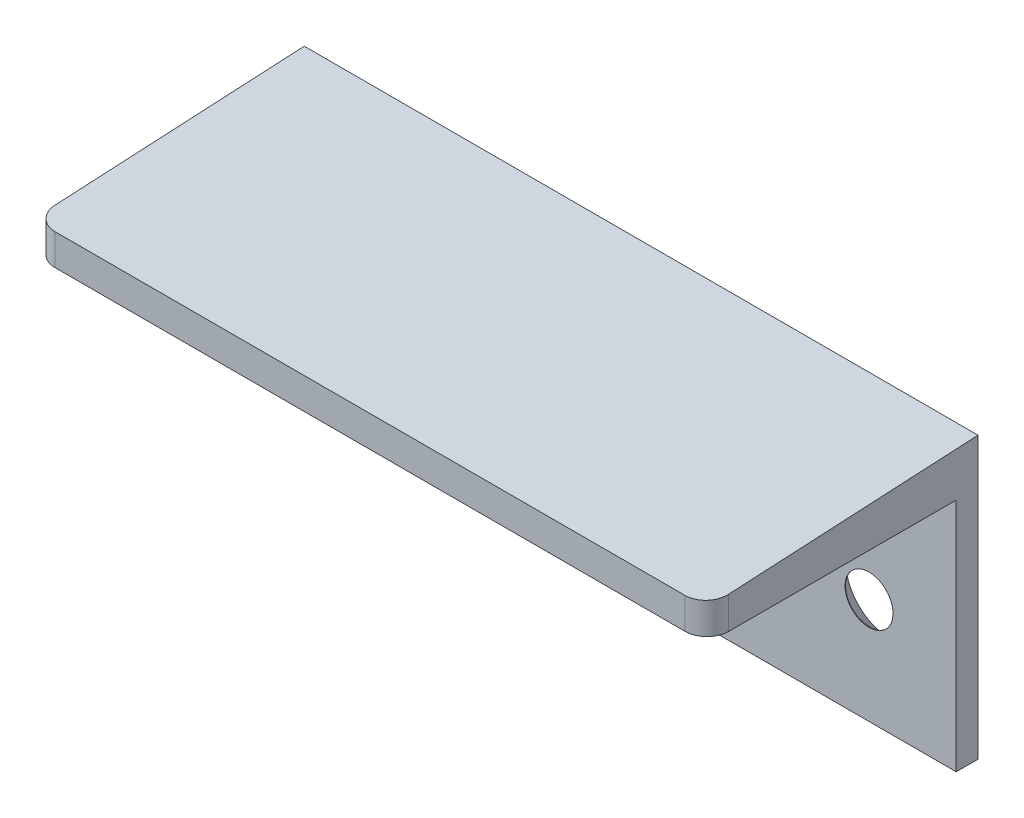
ISO-10303-21;
HEADER;
FILE_DESCRIPTION(('STEP AP214'),'2;1');
FILE_NAME('part.step','',(''),(''),'','','');
FILE_SCHEMA(('AUTOMOTIVE_DESIGN { 1 0 10303 214 1 1 1 1 }'));
ENDSEC;
DATA;
#1=APPLICATION_CONTEXT('core data for automotive mechanical design processes');
#2=APPLICATION_PROTOCOL_DEFINITION('international standard','automotive_design',2000,#1);
#3=PRODUCT_CONTEXT('',#1,'mechanical');
#4=PRODUCT('Part','Part','',(#3));
#5=PRODUCT_RELATED_PRODUCT_CATEGORY('part','',(#4));
#6=PRODUCT_DEFINITION_FORMATION('','',#4);
#7=PRODUCT_DEFINITION_CONTEXT('part definition',#1,'design');
#8=PRODUCT_DEFINITION('design','',#6,#7);
#9=PRODUCT_DEFINITION_SHAPE('','',#8);
#10=(LENGTH_UNIT() NAMED_UNIT(*) SI_UNIT(.MILLI.,.METRE.));
#11=(NAMED_UNIT(*) PLANE_ANGLE_UNIT() SI_UNIT($,.RADIAN.));
#12=(NAMED_UNIT(*) SI_UNIT($,.STERADIAN.) SOLID_ANGLE_UNIT());
#13=UNCERTAINTY_MEASURE_WITH_UNIT(LENGTH_MEASURE(1.E-05),#10,'distance_accuracy_value','');
#14=(GEOMETRIC_REPRESENTATION_CONTEXT(3) GLOBAL_UNCERTAINTY_ASSIGNED_CONTEXT((#13)) GLOBAL_UNIT_ASSIGNED_CONTEXT((#10,
#11,#12)) REPRESENTATION_CONTEXT('',''));
#15=CARTESIAN_POINT('',(0.,0.,0.));
#16=DIRECTION('',(0.,0.,1.));
#17=DIRECTION('',(1.,0.,0.));
#18=AXIS2_PLACEMENT_3D('',#15,#16,#17);
#19=CARTESIAN_POINT('',(38.65,-16.1,2.5));
#20=DIRECTION('',(-1.,0.,0.));
#21=DIRECTION('',(0.,0.,1.));
#22=AXIS2_PLACEMENT_3D('',#19,#20,#21);
#23=PLANE('',#22);
#24=DIRECTION('',(0.,0.0523359562429439,-0.998629534754574));
#25=VECTOR('',#24,1.);
#26=CARTESIAN_POINT('',(38.65,16.1,0.));
#27=LINE('',#26,#25);
#28=CARTESIAN_POINT('',(38.65,14.6011899202843,28.599));
#29=VERTEX_POINT('',#28);
#30=CARTESIAN_POINT('',(38.65,16.1,0.));
#31=VERTEX_POINT('',#30);
#32=EDGE_CURVE('E104',#29,#31,#27,.T.);
#33=ORIENTED_EDGE('',*,*,#32,.F.);
#34=DIRECTION('',(0.,1.,0.));
#35=VECTOR('',#34,1.);
#36=CARTESIAN_POINT('',(38.65,10.9,28.599));
#37=LINE('',#36,#35);
#38=CARTESIAN_POINT('',(38.65,10.9,28.599));
#39=VERTEX_POINT('',#38);
#40=EDGE_CURVE('E48',#29,#39,#37,.F.);
#41=ORIENTED_EDGE('',*,*,#40,.T.);
#42=DIRECTION('',(0.,0.,-1.));
#43=VECTOR('',#42,1.);
#44=CARTESIAN_POINT('',(38.65,10.9,31.099));
#45=LINE('',#44,#43);
#46=CARTESIAN_POINT('',(38.65,10.9,2.5));
#47=VERTEX_POINT('',#46);
#48=EDGE_CURVE('E128',#39,#47,#45,.T.);
#49=ORIENTED_EDGE('',*,*,#48,.T.);
#50=DIRECTION('',(0.,1.,0.));
#51=VECTOR('',#50,1.);
#52=CARTESIAN_POINT('',(38.65,-16.1,2.5));
#53=LINE('',#52,#51);
#54=CARTESIAN_POINT('',(38.65,-16.1,2.5));
#55=VERTEX_POINT('',#54);
#56=EDGE_CURVE('E137',#55,#47,#53,.T.);
#57=ORIENTED_EDGE('',*,*,#56,.F.);
#58=DIRECTION('',(0.,0.,-1.));
#59=VECTOR('',#58,1.);
#60=CARTESIAN_POINT('',(38.65,-16.1,2.5));
#61=LINE('',#60,#59);
#62=CARTESIAN_POINT('',(38.65,-16.1,0.));
#63=VERTEX_POINT('',#62);
#64=EDGE_CURVE('E125',#55,#63,#61,.T.);
#65=ORIENTED_EDGE('',*,*,#64,.T.);
#66=DIRECTION('',(0.,1.,0.));
#67=VECTOR('',#66,1.);
#68=CARTESIAN_POINT('',(38.65,-16.1,0.));
#69=LINE('',#68,#67);
#70=EDGE_CURVE('E119',#63,#31,#69,.T.);
#71=ORIENTED_EDGE('',*,*,#70,.T.);
#72=EDGE_LOOP('',(#33,#41,#49,#57,#65,#71));
#73=FACE_BOUND('',#72,.T.);
#74=ADVANCED_FACE('F39',(#73),#23,.F.);
#75=CARTESIAN_POINT('',(-38.65,-16.1,2.5));
#76=DIRECTION('',(1.,0.,0.));
#77=DIRECTION('',(0.,0.,-1.));
#78=AXIS2_PLACEMENT_3D('',#75,#76,#77);
#79=PLANE('',#78);
#80=DIRECTION('',(0.,-0.0523359562429439,0.998629534754574));
#81=VECTOR('',#80,1.);
#82=CARTESIAN_POINT('',(-38.65,16.1,0.));
#83=LINE('',#82,#81);
#84=CARTESIAN_POINT('',(-38.65,16.1,0.));
#85=VERTEX_POINT('',#84);
#86=CARTESIAN_POINT('',(-38.65,14.6011899202843,28.599));
#87=VERTEX_POINT('',#86);
#88=EDGE_CURVE('E112',#85,#87,#83,.T.);
#89=ORIENTED_EDGE('',*,*,#88,.F.);
#90=DIRECTION('',(0.,-1.,0.));
#91=VECTOR('',#90,1.);
#92=CARTESIAN_POINT('',(-38.65,-16.1,0.));
#93=LINE('',#92,#91);
#94=CARTESIAN_POINT('',(-38.65,-16.1,0.));
#95=VERTEX_POINT('',#94);
#96=EDGE_CURVE('E120',#85,#95,#93,.T.);
#97=ORIENTED_EDGE('',*,*,#96,.T.);
#98=DIRECTION('',(0.,0.,-1.));
#99=VECTOR('',#98,1.);
#100=CARTESIAN_POINT('',(-38.65,-16.1,2.5));
#101=LINE('',#100,#99);
#102=CARTESIAN_POINT('',(-38.65,-16.1,2.5));
#103=VERTEX_POINT('',#102);
#104=EDGE_CURVE('E139',#103,#95,#101,.T.);
#105=ORIENTED_EDGE('',*,*,#104,.F.);
#106=DIRECTION('',(0.,-1.,0.));
#107=VECTOR('',#106,1.);
#108=CARTESIAN_POINT('',(-38.65,-16.1,2.5));
#109=LINE('',#108,#107);
#110=CARTESIAN_POINT('',(-38.65,10.9,2.5));
#111=VERTEX_POINT('',#110);
#112=EDGE_CURVE('E180',#111,#103,#109,.T.);
#113=ORIENTED_EDGE('',*,*,#112,.F.);
#114=DIRECTION('',(0.,0.,-1.));
#115=VECTOR('',#114,1.);
#116=CARTESIAN_POINT('',(-38.65,10.9,31.099));
#117=LINE('',#116,#115);
#118=CARTESIAN_POINT('',(-38.65,10.9,28.599));
#119=VERTEX_POINT('',#118);
#120=EDGE_CURVE('E126',#119,#111,#117,.T.);
#121=ORIENTED_EDGE('',*,*,#120,.F.);
#122=DIRECTION('',(0.,-1.,0.));
#123=VECTOR('',#122,1.);
#124=CARTESIAN_POINT('',(-38.65,16.1,28.599));
#125=LINE('',#124,#123);
#126=EDGE_CURVE('E150',#119,#87,#125,.F.);
#127=ORIENTED_EDGE('',*,*,#126,.T.);
#128=EDGE_LOOP('',(#89,#97,#105,#113,#121,#127));
#129=FACE_BOUND('',#128,.T.);
#130=ADVANCED_FACE('F201',(#129),#79,.F.);
#131=CARTESIAN_POINT('',(0.,0.,31.099));
#132=DIRECTION('',(0.,0.,1.));
#133=DIRECTION('',(1.,0.,0.));
#134=AXIS2_PLACEMENT_3D('',#131,#132,#133);
#135=PLANE('',#134);
#136=DIRECTION('',(0.,1.,0.));
#137=VECTOR('',#136,1.);
#138=CARTESIAN_POINT('',(36.15,16.1,31.099));
#139=LINE('',#138,#137);
#140=CARTESIAN_POINT('',(36.15,10.9,31.099));
#141=VERTEX_POINT('',#140);
#142=CARTESIAN_POINT('',(36.15,14.4701704720767,31.099));
#143=VERTEX_POINT('',#142);
#144=EDGE_CURVE('E142',#141,#143,#139,.T.);
#145=ORIENTED_EDGE('',*,*,#144,.T.);
#146=DIRECTION('',(-1.,0.,0.));
#147=VECTOR('',#146,1.);
#148=CARTESIAN_POINT('',(0.,14.4701704720767,31.099));
#149=LINE('',#148,#147);
#150=CARTESIAN_POINT('',(-36.15,14.4701704720767,31.099));
#151=VERTEX_POINT('',#150);
#152=EDGE_CURVE('E56',#143,#151,#149,.T.);
#153=ORIENTED_EDGE('',*,*,#152,.T.);
#154=DIRECTION('',(0.,-1.,0.));
#155=VECTOR('',#154,1.);
#156=CARTESIAN_POINT('',(-36.15,10.9,31.099));
#157=LINE('',#156,#155);
#158=CARTESIAN_POINT('',(-36.15,10.9,31.099));
#159=VERTEX_POINT('',#158);
#160=EDGE_CURVE('E145',#151,#159,#157,.T.);
#161=ORIENTED_EDGE('',*,*,#160,.T.);
#162=DIRECTION('',(1.,0.,0.));
#163=VECTOR('',#162,1.);
#164=CARTESIAN_POINT('',(-38.65,10.9,31.099));
#165=LINE('',#164,#163);
#166=EDGE_CURVE('E173',#159,#141,#165,.T.);
#167=ORIENTED_EDGE('',*,*,#166,.T.);
#168=EDGE_LOOP('',(#145,#153,#161,#167));
#169=FACE_BOUND('',#168,.T.);
#170=ADVANCED_FACE('F195',(#169),#135,.T.);
#171=CARTESIAN_POINT('',(-36.15,0.,28.599));
#172=DIRECTION('',(0.,1.,0.));
#173=DIRECTION('',(0.,0.,1.));
#174=AXIS2_PLACEMENT_3D('',#171,#172,#173);
#175=CYLINDRICAL_SURFACE('',#174,2.5);
#176=ORIENTED_EDGE('',*,*,#160,.F.);
#177=CARTESIAN_POINT('',(-36.15,14.6011899202843,28.599));
#178=DIRECTION('',(0.,0.998629534754574,0.0523359562429439));
#179=DIRECTION('',(0.,0.052335956242944,-0.998629534754574));
#180=AXIS2_PLACEMENT_3D('',#177,#178,#179);
#181=ELLIPSE('',#180,2.5034308649948,2.5);
#182=EDGE_CURVE('E169',#151,#87,#181,.F.);
#183=ORIENTED_EDGE('',*,*,#182,.T.);
#184=ORIENTED_EDGE('',*,*,#126,.F.);
#185=CARTESIAN_POINT('',(-36.15,10.9,28.599));
#186=DIRECTION('',(0.,1.,0.));
#187=DIRECTION('',(0.,0.,1.));
#188=AXIS2_PLACEMENT_3D('',#185,#186,#187);
#189=CIRCLE('',#188,2.5);
#190=EDGE_CURVE('E63',#159,#119,#189,.F.);
#191=ORIENTED_EDGE('',*,*,#190,.F.);
#192=EDGE_LOOP('',(#176,#183,#184,#191));
#193=FACE_BOUND('',#192,.T.);
#194=ADVANCED_FACE('F199',(#193),#175,.T.);
#195=CARTESIAN_POINT('',(36.15,0.,28.599));
#196=DIRECTION('',(0.,-1.,0.));
#197=DIRECTION('',(0.,0.,-1.));
#198=AXIS2_PLACEMENT_3D('',#195,#196,#197);
#199=CYLINDRICAL_SURFACE('',#198,2.5);
#200=ORIENTED_EDGE('',*,*,#40,.F.);
#201=CARTESIAN_POINT('',(36.15,14.6011899202843,28.599));
#202=DIRECTION('',(0.,0.998629534754574,0.0523359562429439));
#203=DIRECTION('',(0.,-0.052335956242944,0.998629534754574));
#204=AXIS2_PLACEMENT_3D('',#201,#202,#203);
#205=ELLIPSE('',#204,2.5034308649948,2.5);
#206=EDGE_CURVE('E11',#29,#143,#205,.F.);
#207=ORIENTED_EDGE('',*,*,#206,.T.);
#208=ORIENTED_EDGE('',*,*,#144,.F.);
#209=CARTESIAN_POINT('',(36.15,10.9,28.599));
#210=DIRECTION('',(0.,1.,0.));
#211=DIRECTION('',(0.,0.,1.));
#212=AXIS2_PLACEMENT_3D('',#209,#210,#211);
#213=CIRCLE('',#212,2.5);
#214=EDGE_CURVE('E147',#39,#141,#213,.F.);
#215=ORIENTED_EDGE('',*,*,#214,.F.);
#216=EDGE_LOOP('',(#200,#207,#208,#215));
#217=FACE_BOUND('',#216,.T.);
#218=ADVANCED_FACE('F41',(#217),#199,.T.);
#219=CARTESIAN_POINT('',(0.,0.,2.5));
#220=DIRECTION('',(0.,0.,-1.));
#221=DIRECTION('',(-1.,0.,0.));
#222=AXIS2_PLACEMENT_3D('',#219,#220,#221);
#223=PLANE('',#222);
#224=CARTESIAN_POINT('',(28.65,-4.,2.5));
#225=DIRECTION('',(0.,0.,-1.));
#226=DIRECTION('',(-1.,0.,0.));
#227=AXIS2_PLACEMENT_3D('',#224,#225,#226);
#228=CIRCLE('',#227,2.75);
#229=CARTESIAN_POINT('',(25.9,-4.,2.5));
#230=VERTEX_POINT('',#229);
#231=EDGE_CURVE('E43',#230,#230,#228,.T.);
#232=ORIENTED_EDGE('',*,*,#231,.T.);
#233=EDGE_LOOP('',(#232));
#234=FACE_BOUND('',#233,.T.);
#235=CARTESIAN_POINT('',(-28.65,-4.,2.5));
#236=DIRECTION('',(0.,0.,-1.));
#237=DIRECTION('',(-1.,0.,0.));
#238=AXIS2_PLACEMENT_3D('',#235,#236,#237);
#239=CIRCLE('',#238,2.75);
#240=CARTESIAN_POINT('',(-31.4,-4.,2.5));
#241=VERTEX_POINT('',#240);
#242=EDGE_CURVE('E153',#241,#241,#239,.T.);
#243=ORIENTED_EDGE('',*,*,#242,.T.);
#244=EDGE_LOOP('',(#243));
#245=FACE_BOUND('',#244,.T.);
#246=DIRECTION('',(1.,0.,0.));
#247=VECTOR('',#246,1.);
#248=CARTESIAN_POINT('',(-38.65,10.9,2.5));
#249=LINE('',#248,#247);
#250=EDGE_CURVE('E172',#111,#47,#249,.T.);
#251=ORIENTED_EDGE('',*,*,#250,.F.);
#252=ORIENTED_EDGE('',*,*,#112,.T.);
#253=DIRECTION('',(1.,0.,0.));
#254=VECTOR('',#253,1.);
#255=CARTESIAN_POINT('',(-38.65,-16.1,2.5));
#256=LINE('',#255,#254);
#257=EDGE_CURVE('E131',#103,#55,#256,.T.);
#258=ORIENTED_EDGE('',*,*,#257,.T.);
#259=ORIENTED_EDGE('',*,*,#56,.T.);
#260=EDGE_LOOP('',(#251,#252,#258,#259));
#261=FACE_BOUND('',#260,.T.);
#262=ADVANCED_FACE('F186',(#234,#245,#261),#223,.F.);
#263=CARTESIAN_POINT('',(-38.65,-16.1,2.5));
#264=DIRECTION('',(0.,1.,0.));
#265=DIRECTION('',(0.,0.,1.));
#266=AXIS2_PLACEMENT_3D('',#263,#264,#265);
#267=PLANE('',#266);
#268=DIRECTION('',(1.,0.,0.));
#269=VECTOR('',#268,1.);
#270=CARTESIAN_POINT('',(-38.65,-16.1,0.));
#271=LINE('',#270,#269);
#272=EDGE_CURVE('E135',#95,#63,#271,.T.);
#273=ORIENTED_EDGE('',*,*,#272,.T.);
#274=ORIENTED_EDGE('',*,*,#64,.F.);
#275=ORIENTED_EDGE('',*,*,#257,.F.);
#276=ORIENTED_EDGE('',*,*,#104,.T.);
#277=EDGE_LOOP('',(#273,#274,#275,#276));
#278=FACE_BOUND('',#277,.T.);
#279=ADVANCED_FACE('F188',(#278),#267,.F.);
#280=CARTESIAN_POINT('',(0.,0.,0.));
#281=DIRECTION('',(0.,0.,-1.));
#282=DIRECTION('',(-1.,0.,0.));
#283=AXIS2_PLACEMENT_3D('',#280,#281,#282);
#284=PLANE('',#283);
#285=CARTESIAN_POINT('',(28.65,-4.,0.));
#286=DIRECTION('',(0.,0.,-1.));
#287=DIRECTION('',(-1.,0.,0.));
#288=AXIS2_PLACEMENT_3D('',#285,#286,#287);
#289=CIRCLE('',#288,5.2);
#290=CARTESIAN_POINT('',(23.45,-4.,0.));
#291=VERTEX_POINT('',#290);
#292=EDGE_CURVE('E236',#291,#291,#289,.T.);
#293=ORIENTED_EDGE('',*,*,#292,.F.);
#294=EDGE_LOOP('',(#293));
#295=FACE_BOUND('',#294,.T.);
#296=CARTESIAN_POINT('',(-28.65,-4.,0.));
#297=DIRECTION('',(0.,0.,-1.));
#298=DIRECTION('',(-1.,0.,0.));
#299=AXIS2_PLACEMENT_3D('',#296,#297,#298);
#300=CIRCLE('',#299,5.2);
#301=CARTESIAN_POINT('',(-33.85,-4.,0.));
#302=VERTEX_POINT('',#301);
#303=EDGE_CURVE('E160',#302,#302,#300,.T.);
#304=ORIENTED_EDGE('',*,*,#303,.F.);
#305=EDGE_LOOP('',(#304));
#306=FACE_BOUND('',#305,.T.);
#307=ORIENTED_EDGE('',*,*,#70,.F.);
#308=ORIENTED_EDGE('',*,*,#272,.F.);
#309=ORIENTED_EDGE('',*,*,#96,.F.);
#310=DIRECTION('',(-1.,0.,0.));
#311=VECTOR('',#310,1.);
#312=CARTESIAN_POINT('',(-38.65,16.1,0.));
#313=LINE('',#312,#311);
#314=EDGE_CURVE('E107',#31,#85,#313,.T.);
#315=ORIENTED_EDGE('',*,*,#314,.F.);
#316=EDGE_LOOP('',(#307,#308,#309,#315));
#317=FACE_BOUND('',#316,.T.);
#318=ADVANCED_FACE('F117',(#295,#306,#317),#284,.T.);
#319=CARTESIAN_POINT('',(-38.65,10.9,31.099));
#320=DIRECTION('',(0.,1.,0.));
#321=DIRECTION('',(0.,0.,1.));
#322=AXIS2_PLACEMENT_3D('',#319,#320,#321);
#323=PLANE('',#322);
#324=ORIENTED_EDGE('',*,*,#166,.F.);
#325=ORIENTED_EDGE('',*,*,#190,.T.);
#326=ORIENTED_EDGE('',*,*,#120,.T.);
#327=ORIENTED_EDGE('',*,*,#250,.T.);
#328=ORIENTED_EDGE('',*,*,#48,.F.);
#329=ORIENTED_EDGE('',*,*,#214,.T.);
#330=EDGE_LOOP('',(#324,#325,#326,#327,#328,#329));
#331=FACE_BOUND('',#330,.T.);
#332=ADVANCED_FACE('F191',(#331),#323,.F.);
#333=CARTESIAN_POINT('',(0.,16.1,0.));
#334=DIRECTION('',(0.,0.998629534754574,0.0523359562429439));
#335=DIRECTION('',(0.,-0.0523359562429439,0.998629534754574));
#336=AXIS2_PLACEMENT_3D('',#333,#334,#335);
#337=PLANE('',#336);
#338=ORIENTED_EDGE('',*,*,#152,.F.);
#339=ORIENTED_EDGE('',*,*,#206,.F.);
#340=ORIENTED_EDGE('',*,*,#32,.T.);
#341=ORIENTED_EDGE('',*,*,#314,.T.);
#342=ORIENTED_EDGE('',*,*,#88,.T.);
#343=ORIENTED_EDGE('',*,*,#182,.F.);
#344=EDGE_LOOP('',(#338,#339,#340,#341,#342,#343));
#345=FACE_BOUND('',#344,.T.);
#346=ADVANCED_FACE('F106',(#345),#337,.T.);
#347=CARTESIAN_POINT('',(-28.65,-4.,0.));
#348=DIRECTION('',(0.,0.,-1.));
#349=DIRECTION('',(-1.,0.,0.));
#350=AXIS2_PLACEMENT_3D('',#347,#348,#349);
#351=CYLINDRICAL_SURFACE('',#350,2.75);
#352=CARTESIAN_POINT('',(-28.65,-4.,2.45));
#353=DIRECTION('',(0.,0.,-1.));
#354=DIRECTION('',(-1.,0.,0.));
#355=AXIS2_PLACEMENT_3D('',#352,#353,#354);
#356=CIRCLE('',#355,2.75);
#357=CARTESIAN_POINT('',(-31.4,-4.,2.45));
#358=VERTEX_POINT('',#357);
#359=EDGE_CURVE('E155',#358,#358,#356,.T.);
#360=ORIENTED_EDGE('',*,*,#359,.T.);
#361=EDGE_LOOP('',(#360));
#362=FACE_BOUND('',#361,.T.);
#363=ORIENTED_EDGE('',*,*,#242,.F.);
#364=EDGE_LOOP('',(#363));
#365=FACE_BOUND('',#364,.T.);
#366=ADVANCED_FACE('F242',(#362,#365),#351,.F.);
#367=CARTESIAN_POINT('',(-28.65,-4.,0.));
#368=DIRECTION('',(0.,0.,-1.));
#369=DIRECTION('',(-1.,0.,0.));
#370=AXIS2_PLACEMENT_3D('',#367,#368,#369);
#371=CONICAL_SURFACE('',#370,5.2,0.785398163397448);
#372=ORIENTED_EDGE('',*,*,#359,.F.);
#373=EDGE_LOOP('',(#372));
#374=FACE_BOUND('',#373,.T.);
#375=ORIENTED_EDGE('',*,*,#303,.T.);
#376=EDGE_LOOP('',(#375));
#377=FACE_BOUND('',#376,.T.);
#378=ADVANCED_FACE('F239',(#374,#377),#371,.F.);
#379=CARTESIAN_POINT('',(28.65,-4.,0.));
#380=DIRECTION('',(0.,0.,-1.));
#381=DIRECTION('',(-1.,0.,0.));
#382=AXIS2_PLACEMENT_3D('',#379,#380,#381);
#383=CYLINDRICAL_SURFACE('',#382,2.75);
#384=CARTESIAN_POINT('',(28.65,-4.,2.45));
#385=DIRECTION('',(0.,0.,-1.));
#386=DIRECTION('',(-1.,0.,0.));
#387=AXIS2_PLACEMENT_3D('',#384,#385,#386);
#388=CIRCLE('',#387,2.75);
#389=CARTESIAN_POINT('',(25.9,-4.,2.45));
#390=VERTEX_POINT('',#389);
#391=EDGE_CURVE('E292',#390,#390,#388,.T.);
#392=ORIENTED_EDGE('',*,*,#391,.T.);
#393=EDGE_LOOP('',(#392));
#394=FACE_BOUND('',#393,.T.);
#395=ORIENTED_EDGE('',*,*,#231,.F.);
#396=EDGE_LOOP('',(#395));
#397=FACE_BOUND('',#396,.T.);
#398=ADVANCED_FACE('F241',(#394,#397),#383,.F.);
#399=CARTESIAN_POINT('',(28.65,-4.,0.));
#400=DIRECTION('',(0.,0.,-1.));
#401=DIRECTION('',(-1.,0.,0.));
#402=AXIS2_PLACEMENT_3D('',#399,#400,#401);
#403=CONICAL_SURFACE('',#402,5.2,0.785398163397449);
#404=ORIENTED_EDGE('',*,*,#391,.F.);
#405=EDGE_LOOP('',(#404));
#406=FACE_BOUND('',#405,.T.);
#407=ORIENTED_EDGE('',*,*,#292,.T.);
#408=EDGE_LOOP('',(#407));
#409=FACE_BOUND('',#408,.T.);
#410=ADVANCED_FACE('F248',(#406,#409),#403,.F.);
#411=CLOSED_SHELL('',(#74,#130,#170,#194,#218,#262,#279,#318,#332,#346,#366,#378,#398,#410));
#412=MANIFOLD_SOLID_BREP('B2',#411);
#413=ADVANCED_BREP_SHAPE_REPRESENTATION('',(#18,#412),#14);
#414=SHAPE_DEFINITION_REPRESENTATION(#9,#413);
ENDSEC;
END-ISO-10303-21;
